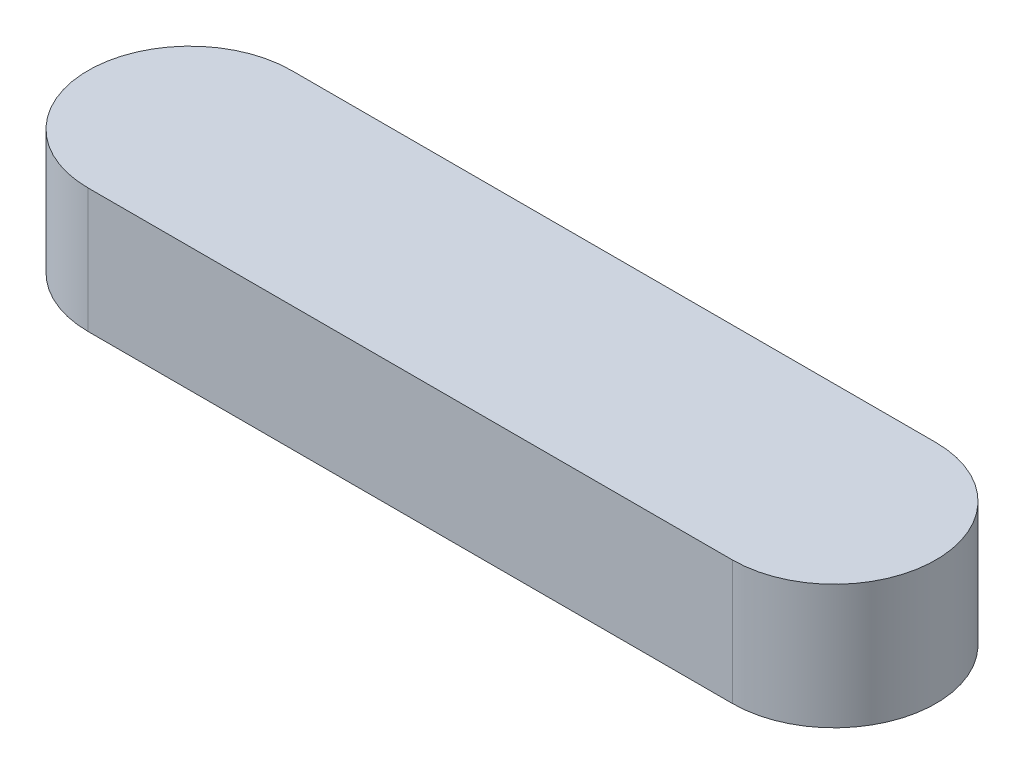
ISO-10303-21;
HEADER;
FILE_DESCRIPTION(('STEP AP214'),'2;1');
FILE_NAME('part.step','',(''),(''),'','','');
FILE_SCHEMA(('AUTOMOTIVE_DESIGN { 1 0 10303 214 1 1 1 1 }'));
ENDSEC;
DATA;
#1=APPLICATION_CONTEXT('core data for automotive mechanical design processes');
#2=APPLICATION_PROTOCOL_DEFINITION('international standard','automotive_design',2000,#1);
#3=PRODUCT_CONTEXT('',#1,'mechanical');
#4=PRODUCT('Part','Part','',(#3));
#5=PRODUCT_RELATED_PRODUCT_CATEGORY('part','',(#4));
#6=PRODUCT_DEFINITION_FORMATION('','',#4);
#7=PRODUCT_DEFINITION_CONTEXT('part definition',#1,'design');
#8=PRODUCT_DEFINITION('design','',#6,#7);
#9=PRODUCT_DEFINITION_SHAPE('','',#8);
#10=(LENGTH_UNIT() NAMED_UNIT(*) SI_UNIT(.MILLI.,.METRE.));
#11=(NAMED_UNIT(*) PLANE_ANGLE_UNIT() SI_UNIT($,.RADIAN.));
#12=(NAMED_UNIT(*) SI_UNIT($,.STERADIAN.) SOLID_ANGLE_UNIT());
#13=UNCERTAINTY_MEASURE_WITH_UNIT(LENGTH_MEASURE(1.E-05),#10,'distance_accuracy_value','');
#14=(GEOMETRIC_REPRESENTATION_CONTEXT(3) GLOBAL_UNCERTAINTY_ASSIGNED_CONTEXT((#13)) GLOBAL_UNIT_ASSIGNED_CONTEXT((#10,
#11,#12)) REPRESENTATION_CONTEXT('',''));
#15=CARTESIAN_POINT('',(0.,0.,0.));
#16=DIRECTION('',(0.,0.,1.));
#17=DIRECTION('',(1.,0.,0.));
#18=AXIS2_PLACEMENT_3D('',#15,#16,#17);
#19=CARTESIAN_POINT('',(0.,11.,0.));
#20=DIRECTION('',(0.,-1.,0.));
#21=DIRECTION('',(0.,0.,-1.));
#22=AXIS2_PLACEMENT_3D('',#19,#20,#21);
#23=CYLINDRICAL_SURFACE('',#22,9.);
#24=CARTESIAN_POINT('',(0.,0.,0.));
#25=DIRECTION('',(0.,1.,0.));
#26=DIRECTION('',(0.,0.,1.));
#27=AXIS2_PLACEMENT_3D('',#24,#25,#26);
#28=CIRCLE('',#27,9.);
#29=CARTESIAN_POINT('',(0.,0.,-9.));
#30=VERTEX_POINT('',#29);
#31=CARTESIAN_POINT('',(0.,0.,9.));
#32=VERTEX_POINT('',#31);
#33=EDGE_CURVE('E102',#30,#32,#28,.T.);
#34=ORIENTED_EDGE('',*,*,#33,.T.);
#35=DIRECTION('',(0.,-1.,0.));
#36=VECTOR('',#35,1.);
#37=CARTESIAN_POINT('',(0.,11.,9.));
#38=LINE('',#37,#36);
#39=CARTESIAN_POINT('',(0.,11.,9.));
#40=VERTEX_POINT('',#39);
#41=EDGE_CURVE('E11',#40,#32,#38,.T.);
#42=ORIENTED_EDGE('',*,*,#41,.F.);
#43=CARTESIAN_POINT('',(0.,11.,0.));
#44=DIRECTION('',(0.,1.,0.));
#45=DIRECTION('',(0.,0.,1.));
#46=AXIS2_PLACEMENT_3D('',#43,#44,#45);
#47=CIRCLE('',#46,9.);
#48=CARTESIAN_POINT('',(0.,11.,-9.));
#49=VERTEX_POINT('',#48);
#50=EDGE_CURVE('E90',#49,#40,#47,.T.);
#51=ORIENTED_EDGE('',*,*,#50,.F.);
#52=DIRECTION('',(0.,-1.,0.));
#53=VECTOR('',#52,1.);
#54=CARTESIAN_POINT('',(0.,11.,-9.));
#55=LINE('',#54,#53);
#56=EDGE_CURVE('E98',#49,#30,#55,.T.);
#57=ORIENTED_EDGE('',*,*,#56,.T.);
#58=EDGE_LOOP('',(#34,#42,#51,#57));
#59=FACE_BOUND('',#58,.T.);
#60=ADVANCED_FACE('F39',(#59),#23,.T.);
#61=CARTESIAN_POINT('',(0.,11.,9.));
#62=DIRECTION('',(0.,0.,-1.));
#63=DIRECTION('',(-1.,0.,0.));
#64=AXIS2_PLACEMENT_3D('',#61,#62,#63);
#65=PLANE('',#64);
#66=DIRECTION('',(1.,0.,0.));
#67=VECTOR('',#66,1.);
#68=CARTESIAN_POINT('',(0.,0.,9.));
#69=LINE('',#68,#67);
#70=CARTESIAN_POINT('',(57.,0.,9.));
#71=VERTEX_POINT('',#70);
#72=EDGE_CURVE('E94',#32,#71,#69,.T.);
#73=ORIENTED_EDGE('',*,*,#72,.T.);
#74=DIRECTION('',(0.,-1.,0.));
#75=VECTOR('',#74,1.);
#76=CARTESIAN_POINT('',(57.,11.,9.));
#77=LINE('',#76,#75);
#78=CARTESIAN_POINT('',(57.,11.,9.));
#79=VERTEX_POINT('',#78);
#80=EDGE_CURVE('E47',#79,#71,#77,.T.);
#81=ORIENTED_EDGE('',*,*,#80,.F.);
#82=DIRECTION('',(1.,0.,0.));
#83=VECTOR('',#82,1.);
#84=CARTESIAN_POINT('',(0.,11.,9.));
#85=LINE('',#84,#83);
#86=EDGE_CURVE('E85',#40,#79,#85,.T.);
#87=ORIENTED_EDGE('',*,*,#86,.F.);
#88=ORIENTED_EDGE('',*,*,#41,.T.);
#89=EDGE_LOOP('',(#73,#81,#87,#88));
#90=FACE_BOUND('',#89,.T.);
#91=ADVANCED_FACE('F93',(#90),#65,.F.);
#92=CARTESIAN_POINT('',(57.,11.,0.));
#93=DIRECTION('',(0.,-1.,0.));
#94=DIRECTION('',(0.,0.,-1.));
#95=AXIS2_PLACEMENT_3D('',#92,#93,#94);
#96=CYLINDRICAL_SURFACE('',#95,9.);
#97=CARTESIAN_POINT('',(57.,0.,0.));
#98=DIRECTION('',(0.,1.,0.));
#99=DIRECTION('',(0.,0.,1.));
#100=AXIS2_PLACEMENT_3D('',#97,#98,#99);
#101=CIRCLE('',#100,9.);
#102=CARTESIAN_POINT('',(57.,0.,-9.));
#103=VERTEX_POINT('',#102);
#104=EDGE_CURVE('E72',#71,#103,#101,.T.);
#105=ORIENTED_EDGE('',*,*,#104,.T.);
#106=DIRECTION('',(0.,-1.,0.));
#107=VECTOR('',#106,1.);
#108=CARTESIAN_POINT('',(57.,11.,-9.));
#109=LINE('',#108,#107);
#110=CARTESIAN_POINT('',(57.,11.,-9.));
#111=VERTEX_POINT('',#110);
#112=EDGE_CURVE('E95',#111,#103,#109,.T.);
#113=ORIENTED_EDGE('',*,*,#112,.F.);
#114=CARTESIAN_POINT('',(57.,11.,0.));
#115=DIRECTION('',(0.,1.,0.));
#116=DIRECTION('',(0.,0.,1.));
#117=AXIS2_PLACEMENT_3D('',#114,#115,#116);
#118=CIRCLE('',#117,9.);
#119=EDGE_CURVE('E88',#79,#111,#118,.T.);
#120=ORIENTED_EDGE('',*,*,#119,.F.);
#121=ORIENTED_EDGE('',*,*,#80,.T.);
#122=EDGE_LOOP('',(#105,#113,#120,#121));
#123=FACE_BOUND('',#122,.T.);
#124=ADVANCED_FACE('F96',(#123),#96,.T.);
#125=CARTESIAN_POINT('',(0.,11.,-9.));
#126=DIRECTION('',(0.,0.,1.));
#127=DIRECTION('',(1.,0.,0.));
#128=AXIS2_PLACEMENT_3D('',#125,#126,#127);
#129=PLANE('',#128);
#130=DIRECTION('',(-1.,0.,0.));
#131=VECTOR('',#130,1.);
#132=CARTESIAN_POINT('',(0.,0.,-9.));
#133=LINE('',#132,#131);
#134=EDGE_CURVE('E78',#103,#30,#133,.T.);
#135=ORIENTED_EDGE('',*,*,#134,.T.);
#136=ORIENTED_EDGE('',*,*,#56,.F.);
#137=DIRECTION('',(-1.,0.,0.));
#138=VECTOR('',#137,1.);
#139=CARTESIAN_POINT('',(0.,11.,-9.));
#140=LINE('',#139,#138);
#141=EDGE_CURVE('E55',#111,#49,#140,.T.);
#142=ORIENTED_EDGE('',*,*,#141,.F.);
#143=ORIENTED_EDGE('',*,*,#112,.T.);
#144=EDGE_LOOP('',(#135,#136,#142,#143));
#145=FACE_BOUND('',#144,.T.);
#146=ADVANCED_FACE('F109',(#145),#129,.F.);
#147=CARTESIAN_POINT('',(0.,11.,0.));
#148=DIRECTION('',(0.,1.,0.));
#149=DIRECTION('',(0.,0.,1.));
#150=AXIS2_PLACEMENT_3D('',#147,#148,#149);
#151=PLANE('',#150);
#152=ORIENTED_EDGE('',*,*,#50,.T.);
#153=ORIENTED_EDGE('',*,*,#86,.T.);
#154=ORIENTED_EDGE('',*,*,#119,.T.);
#155=ORIENTED_EDGE('',*,*,#141,.T.);
#156=EDGE_LOOP('',(#152,#153,#154,#155));
#157=FACE_BOUND('',#156,.T.);
#158=ADVANCED_FACE('F86',(#157),#151,.T.);
#159=CARTESIAN_POINT('',(0.,0.,0.));
#160=DIRECTION('',(0.,1.,0.));
#161=DIRECTION('',(0.,0.,1.));
#162=AXIS2_PLACEMENT_3D('',#159,#160,#161);
#163=PLANE('',#162);
#164=ORIENTED_EDGE('',*,*,#33,.F.);
#165=ORIENTED_EDGE('',*,*,#134,.F.);
#166=ORIENTED_EDGE('',*,*,#104,.F.);
#167=ORIENTED_EDGE('',*,*,#72,.F.);
#168=EDGE_LOOP('',(#164,#165,#166,#167));
#169=FACE_BOUND('',#168,.T.);
#170=ADVANCED_FACE('F112',(#169),#163,.F.);
#171=CLOSED_SHELL('',(#60,#91,#124,#146,#158,#170));
#172=MANIFOLD_SOLID_BREP('B2',#171);
#173=ADVANCED_BREP_SHAPE_REPRESENTATION('',(#18,#172),#14);
#174=SHAPE_DEFINITION_REPRESENTATION(#9,#173);
ENDSEC;
END-ISO-10303-21;
